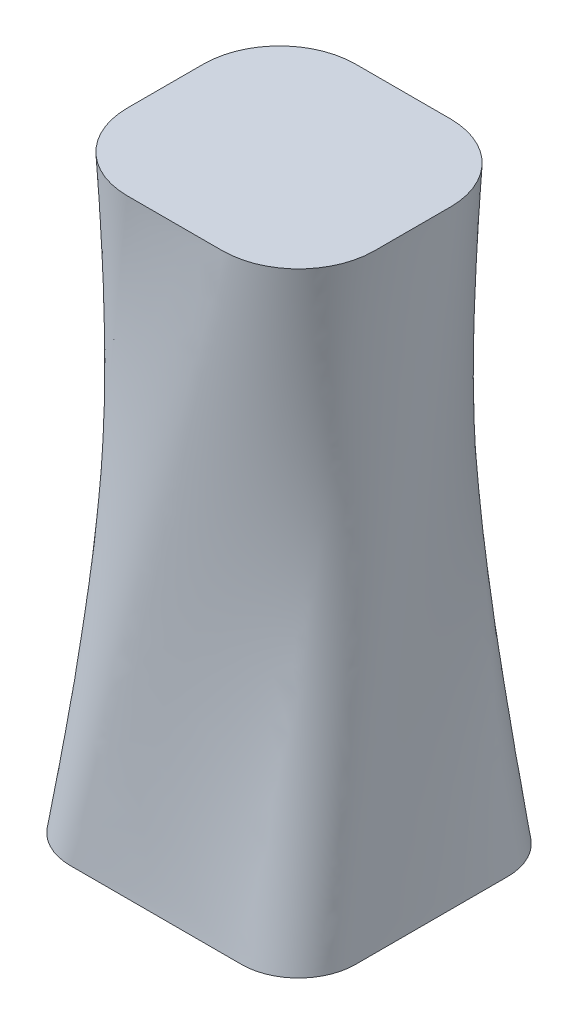
ISO-10303-21;
HEADER;
FILE_DESCRIPTION(('STEP AP214'),'2;1');
FILE_NAME('part.step','',(''),(''),'','','');
FILE_SCHEMA(('AUTOMOTIVE_DESIGN { 1 0 10303 214 1 1 1 1 }'));
ENDSEC;
DATA;
#1=APPLICATION_CONTEXT('core data for automotive mechanical design processes');
#2=APPLICATION_PROTOCOL_DEFINITION('international standard','automotive_design',2000,#1);
#3=PRODUCT_CONTEXT('',#1,'mechanical');
#4=PRODUCT('Part','Part','',(#3));
#5=PRODUCT_RELATED_PRODUCT_CATEGORY('part','',(#4));
#6=PRODUCT_DEFINITION_FORMATION('','',#4);
#7=PRODUCT_DEFINITION_CONTEXT('part definition',#1,'design');
#8=PRODUCT_DEFINITION('design','',#6,#7);
#9=PRODUCT_DEFINITION_SHAPE('','',#8);
#10=(LENGTH_UNIT() NAMED_UNIT(*) SI_UNIT(.MILLI.,.METRE.));
#11=(NAMED_UNIT(*) PLANE_ANGLE_UNIT() SI_UNIT($,.RADIAN.));
#12=(NAMED_UNIT(*) SI_UNIT($,.STERADIAN.) SOLID_ANGLE_UNIT());
#13=UNCERTAINTY_MEASURE_WITH_UNIT(LENGTH_MEASURE(1.E-05),#10,'distance_accuracy_value','');
#14=(GEOMETRIC_REPRESENTATION_CONTEXT(3) GLOBAL_UNCERTAINTY_ASSIGNED_CONTEXT((#13)) GLOBAL_UNIT_ASSIGNED_CONTEXT((#10,
#11,#12)) REPRESENTATION_CONTEXT('',''));
#15=CARTESIAN_POINT('',(0.,0.,0.));
#16=DIRECTION('',(0.,0.,1.));
#17=DIRECTION('',(1.,0.,0.));
#18=AXIS2_PLACEMENT_3D('',#15,#16,#17);
#19=CARTESIAN_POINT('',(-2.5,31.,2.));
#20=DIRECTION('',(0.,1.,0.));
#21=DIRECTION('',(0.,0.,1.));
#22=AXIS2_PLACEMENT_3D('',#19,#20,#21);
#23=PLANE('',#22);
#24=DIRECTION('',(0.,0.,1.));
#25=VECTOR('',#24,1.);
#26=CARTESIAN_POINT('',(-6.5,31.,-1.99999999999997));
#27=LINE('',#26,#25);
#28=CARTESIAN_POINT('',(-6.5,31.,-1.99999999999997));
#29=VERTEX_POINT('',#28);
#30=CARTESIAN_POINT('',(-6.5,31.,1.99999999981758));
#31=VERTEX_POINT('',#30);
#32=EDGE_CURVE('E422',#29,#31,#27,.T.);
#33=ORIENTED_EDGE('',*,*,#32,.T.);
#34=CARTESIAN_POINT('',(-2.5,31.,2.));
#35=DIRECTION('',(0.,1.,0.));
#36=DIRECTION('',(0.,0.,1.));
#37=AXIS2_PLACEMENT_3D('',#34,#35,#36);
#38=CIRCLE('',#37,4.);
#39=CARTESIAN_POINT('',(-2.49999999984952,31.,6.));
#40=VERTEX_POINT('',#39);
#41=EDGE_CURVE('E538',#31,#40,#38,.T.);
#42=ORIENTED_EDGE('',*,*,#41,.T.);
#43=DIRECTION('',(1.,0.,0.));
#44=VECTOR('',#43,1.);
#45=CARTESIAN_POINT('',(-2.49999999999997,31.,6.));
#46=LINE('',#45,#44);
#47=CARTESIAN_POINT('',(2.50000000000677,31.,6.));
#48=VERTEX_POINT('',#47);
#49=EDGE_CURVE('E530',#40,#48,#46,.T.);
#50=ORIENTED_EDGE('',*,*,#49,.T.);
#51=CARTESIAN_POINT('',(2.5,31.,2.));
#52=DIRECTION('',(0.,1.,0.));
#53=DIRECTION('',(0.,0.,1.));
#54=AXIS2_PLACEMENT_3D('',#51,#52,#53);
#55=CIRCLE('',#54,4.);
#56=CARTESIAN_POINT('',(6.5,31.,1.99999999999073));
#57=VERTEX_POINT('',#56);
#58=EDGE_CURVE('E518',#48,#57,#55,.T.);
#59=ORIENTED_EDGE('',*,*,#58,.T.);
#60=DIRECTION('',(0.,0.,1.));
#61=VECTOR('',#60,1.);
#62=CARTESIAN_POINT('',(6.5,31.,-1.99999999999997));
#63=LINE('',#62,#61);
#64=CARTESIAN_POINT('',(6.5,31.,-1.99999999986419));
#65=VERTEX_POINT('',#64);
#66=EDGE_CURVE('E513',#65,#57,#63,.T.);
#67=ORIENTED_EDGE('',*,*,#66,.F.);
#68=CARTESIAN_POINT('',(2.5,31.,-2.));
#69=DIRECTION('',(0.,1.,0.));
#70=DIRECTION('',(0.,0.,1.));
#71=AXIS2_PLACEMENT_3D('',#68,#69,#70);
#72=CIRCLE('',#71,4.);
#73=CARTESIAN_POINT('',(2.49999999984938,31.,-6.));
#74=VERTEX_POINT('',#73);
#75=EDGE_CURVE('E504',#65,#74,#72,.T.);
#76=ORIENTED_EDGE('',*,*,#75,.T.);
#77=DIRECTION('',(1.,0.,0.));
#78=VECTOR('',#77,1.);
#79=CARTESIAN_POINT('',(-2.49999999999997,31.,-6.));
#80=LINE('',#79,#78);
#81=CARTESIAN_POINT('',(-2.49999999999997,31.,-6.));
#82=VERTEX_POINT('',#81);
#83=EDGE_CURVE('E238',#82,#74,#80,.T.);
#84=ORIENTED_EDGE('',*,*,#83,.F.);
#85=CARTESIAN_POINT('',(-2.5,31.,-2.));
#86=DIRECTION('',(0.,1.,0.));
#87=DIRECTION('',(0.,0.,1.));
#88=AXIS2_PLACEMENT_3D('',#85,#86,#87);
#89=CIRCLE('',#88,4.);
#90=EDGE_CURVE('E12',#82,#29,#89,.T.);
#91=ORIENTED_EDGE('',*,*,#90,.T.);
#92=EDGE_LOOP('',(#33,#42,#50,#59,#67,#76,#84,#91));
#93=FACE_BOUND('',#92,.T.);
#94=ADVANCED_FACE('F229',(#93),#23,.T.);
#95=CARTESIAN_POINT('',(-4.5,0.,4.));
#96=DIRECTION('',(0.,1.,0.));
#97=DIRECTION('',(0.,0.,1.));
#98=AXIS2_PLACEMENT_3D('',#95,#96,#97);
#99=PLANE('',#98);
#100=DIRECTION('',(0.,0.,1.));
#101=VECTOR('',#100,1.);
#102=CARTESIAN_POINT('',(-7.5,0.,-3.99999999999998));
#103=LINE('',#102,#101);
#104=CARTESIAN_POINT('',(-7.5,0.,-3.99999999999998));
#105=VERTEX_POINT('',#104);
#106=CARTESIAN_POINT('',(-7.5,0.,3.99999999999998));
#107=VERTEX_POINT('',#106);
#108=EDGE_CURVE('E297',#105,#107,#103,.T.);
#109=ORIENTED_EDGE('',*,*,#108,.F.);
#110=CARTESIAN_POINT('',(-4.5,0.,-4.));
#111=DIRECTION('',(0.,1.,0.));
#112=DIRECTION('',(0.,0.,1.));
#113=AXIS2_PLACEMENT_3D('',#110,#111,#112);
#114=CIRCLE('',#113,3.);
#115=CARTESIAN_POINT('',(-4.49999999999998,0.,-7.));
#116=VERTEX_POINT('',#115);
#117=EDGE_CURVE('E313',#116,#105,#114,.T.);
#118=ORIENTED_EDGE('',*,*,#117,.F.);
#119=DIRECTION('',(1.,0.,0.));
#120=VECTOR('',#119,1.);
#121=CARTESIAN_POINT('',(-4.49999999999998,0.,-7.));
#122=LINE('',#121,#120);
#123=CARTESIAN_POINT('',(4.49999999999998,0.,-7.));
#124=VERTEX_POINT('',#123);
#125=EDGE_CURVE('E424',#116,#124,#122,.T.);
#126=ORIENTED_EDGE('',*,*,#125,.T.);
#127=CARTESIAN_POINT('',(4.5,0.,-4.));
#128=DIRECTION('',(0.,1.,0.));
#129=DIRECTION('',(0.,0.,1.));
#130=AXIS2_PLACEMENT_3D('',#127,#128,#129);
#131=CIRCLE('',#130,3.);
#132=CARTESIAN_POINT('',(7.5,0.,-3.99999999999998));
#133=VERTEX_POINT('',#132);
#134=EDGE_CURVE('E445',#133,#124,#131,.T.);
#135=ORIENTED_EDGE('',*,*,#134,.F.);
#136=DIRECTION('',(0.,0.,1.));
#137=VECTOR('',#136,1.);
#138=CARTESIAN_POINT('',(7.5,0.,-3.99999999999998));
#139=LINE('',#138,#137);
#140=CARTESIAN_POINT('',(7.5,0.,3.99999999999998));
#141=VERTEX_POINT('',#140);
#142=EDGE_CURVE('E442',#133,#141,#139,.T.);
#143=ORIENTED_EDGE('',*,*,#142,.T.);
#144=CARTESIAN_POINT('',(4.5,0.,4.));
#145=DIRECTION('',(0.,1.,0.));
#146=DIRECTION('',(0.,0.,1.));
#147=AXIS2_PLACEMENT_3D('',#144,#145,#146);
#148=CIRCLE('',#147,3.);
#149=CARTESIAN_POINT('',(4.49999999999998,0.,7.));
#150=VERTEX_POINT('',#149);
#151=EDGE_CURVE('E464',#150,#141,#148,.T.);
#152=ORIENTED_EDGE('',*,*,#151,.F.);
#153=DIRECTION('',(1.,0.,0.));
#154=VECTOR('',#153,1.);
#155=CARTESIAN_POINT('',(-4.49999999999998,0.,7.));
#156=LINE('',#155,#154);
#157=CARTESIAN_POINT('',(-4.5,0.,7.));
#158=VERTEX_POINT('',#157);
#159=EDGE_CURVE('E301',#158,#150,#156,.T.);
#160=ORIENTED_EDGE('',*,*,#159,.F.);
#161=CARTESIAN_POINT('',(-4.5,0.,4.));
#162=DIRECTION('',(0.,1.,0.));
#163=DIRECTION('',(0.,0.,1.));
#164=AXIS2_PLACEMENT_3D('',#161,#162,#163);
#165=CIRCLE('',#164,3.);
#166=EDGE_CURVE('E298',#107,#158,#165,.T.);
#167=ORIENTED_EDGE('',*,*,#166,.F.);
#168=EDGE_LOOP('',(#109,#118,#126,#135,#143,#152,#160,#167));
#169=FACE_BOUND('',#168,.T.);
#170=ADVANCED_FACE('F299',(#169),#99,.F.);
#171=CARTESIAN_POINT('',(-7.5,0.,3.99999999833455));
#172=CARTESIAN_POINT('',(-2.49999999852181,31.,6.));
#173=CARTESIAN_POINT('',(-7.5,0.,4.43268062166775));
#174=CARTESIAN_POINT('',(-2.1159639488375,31.,6.));
#175=CARTESIAN_POINT('',(-7.31937777126057,0.,5.21781728944466));
#176=CARTESIAN_POINT('',(-1.29794523551076,31.,6.));
#177=CARTESIAN_POINT('',(-6.68503805717259,0.,6.15551359255273));
#178=CARTESIAN_POINT('',(0.0301714182047144,31.,6.));
#179=CARTESIAN_POINT('',(-5.75040107651129,0.,6.8067756069301));
#180=CARTESIAN_POINT('',(1.33929821834054,31.,6.));
#181=CARTESIAN_POINT('',(-4.94976830088231,0.,7.));
#182=CARTESIAN_POINT('',(2.1299099212814,31.,6.));
#183=CARTESIAN_POINT('',(-3.80706922211005,0.,7.));
#184=CARTESIAN_POINT('',(3.07017535983645,31.,6.));
#185=CARTESIAN_POINT('',(-2.36118976571797,0.,7.));
#186=CARTESIAN_POINT('',(4.14151834668722,31.,5.7595458128356));
#187=CARTESIAN_POINT('',(-0.0614380050539939,0.,7.));
#188=CARTESIAN_POINT('',(5.42310273641352,31.,4.87050244857991));
#189=CARTESIAN_POINT('',(2.27196869013641,0.,7.));
#190=CARTESIAN_POINT('',(6.27992651908755,31.,3.58462258470245));
#191=CARTESIAN_POINT('',(3.7748015249726,0.,7.));
#192=CARTESIAN_POINT('',(6.50000000000001,31.,2.54384033776577));
#193=CARTESIAN_POINT('',(4.91750060395481,0.,7.));
#194=CARTESIAN_POINT('',(6.5,31.,1.6869082323727));
#195=CARTESIAN_POINT('',(5.71763908175937,0.,6.82640753124153));
#196=CARTESIAN_POINT('',(6.50000000000001,31.,1.03916363355548));
#197=CARTESIAN_POINT('',(6.6896190376722,0.,6.15775292897931));
#198=CARTESIAN_POINT('',(6.49999999999999,31.,0.0226839039705459));
#199=CARTESIAN_POINT('',(7.33828490119332,0.,5.18352472394748));
#200=CARTESIAN_POINT('',(6.50000000000001,31.,-1.00572024928125));
#201=CARTESIAN_POINT('',(7.5,0.,4.40234486648921));
#202=CARTESIAN_POINT('',(6.5,31.,-1.67453899870387));
#203=CARTESIAN_POINT('',(7.5,0.,3.34297912074172));
#204=CARTESIAN_POINT('',(6.50000000000001,31.,-2.53147110417742));
#205=CARTESIAN_POINT('',(7.50000000000002,0.,1.99865119187058));
#206=CARTESIAN_POINT('',(6.28793458543806,30.9999999999999,-3.56923663381483));
#207=CARTESIAN_POINT('',(7.49999999999999,0.,-0.0548376465408945));
#208=CARTESIAN_POINT('',(5.42500270127936,31.0000000000001,-4.87221530250068));
#209=CARTESIAN_POINT('',(7.50000000000001,0.,-2.07995211905528));
#210=CARTESIAN_POINT('',(4.12557436206181,31.,-5.76847263144623));
#211=CARTESIAN_POINT('',(7.5,0.,-3.37331487611765));
#212=CARTESIAN_POINT('',(3.05622938748327,31.,-6.));
#213=CARTESIAN_POINT('',(7.5,0.,-4.43268062166775));
#214=CARTESIAN_POINT('',(2.11596394883748,31.,-6.));
#215=CARTESIAN_POINT('',(7.31937777126056,0.,-5.21781728944466));
#216=CARTESIAN_POINT('',(1.29794523551074,31.,-5.99999999999999));
#217=CARTESIAN_POINT('',(6.68503805717258,0.,-6.15551359255273));
#218=CARTESIAN_POINT('',(-0.0301714182047216,31.,-6.));
#219=CARTESIAN_POINT('',(5.75040107651128,0.,-6.80677560693012));
#220=CARTESIAN_POINT('',(-1.33929821834054,31.,-6.));
#221=CARTESIAN_POINT('',(4.94976830088229,0.,-7.));
#222=CARTESIAN_POINT('',(-2.1299099212814,31.,-6.));
#223=CARTESIAN_POINT('',(3.80706922211003,0.,-7.));
#224=CARTESIAN_POINT('',(-3.07017535983645,31.,-6.));
#225=CARTESIAN_POINT('',(2.36118976571795,0.,-6.99999999999999));
#226=CARTESIAN_POINT('',(-4.14151834668721,31.,-5.7595458128356));
#227=CARTESIAN_POINT('',(0.0614380050539796,0.,-7.00000000000001));
#228=CARTESIAN_POINT('',(-5.42310273641353,31.,-4.87050244857991));
#229=CARTESIAN_POINT('',(-2.27196869013642,0.,-6.99999999999999));
#230=CARTESIAN_POINT('',(-6.27992651908754,31.,-3.58462258470245));
#231=CARTESIAN_POINT('',(-3.7748015249726,0.,-7.));
#232=CARTESIAN_POINT('',(-6.5,31.,-2.54384033776577));
#233=CARTESIAN_POINT('',(-4.91750060395481,0.,-7.));
#234=CARTESIAN_POINT('',(-6.5,31.,-1.6869082323727));
#235=CARTESIAN_POINT('',(-5.71763908175937,0.,-6.82640753124155));
#236=CARTESIAN_POINT('',(-6.5,31.,-1.03916363355548));
#237=CARTESIAN_POINT('',(-6.68961903767221,0.,-6.15775292897929));
#238=CARTESIAN_POINT('',(-6.5,31.,-0.0226839039705443));
#239=CARTESIAN_POINT('',(-7.33828490119331,0.,-5.18352472394749));
#240=CARTESIAN_POINT('',(-6.5,31.,1.00572024928125));
#241=CARTESIAN_POINT('',(-7.5,0.,-4.40234486648921));
#242=CARTESIAN_POINT('',(-6.5,31.,1.67453899870386));
#243=CARTESIAN_POINT('',(-7.5,0.,-3.34297912074172));
#244=CARTESIAN_POINT('',(-6.5,31.,2.53147110417742));
#245=CARTESIAN_POINT('',(-7.50000000000001,0.,-1.99865119187058));
#246=CARTESIAN_POINT('',(-6.28793458543806,31.,3.56923663381482));
#247=CARTESIAN_POINT('',(-7.49999999999999,0.,0.0548376465408955));
#248=CARTESIAN_POINT('',(-5.42500270127938,31.,4.87221530250066));
#249=CARTESIAN_POINT('',(-7.50000000000001,0.,2.07995211905527));
#250=CARTESIAN_POINT('',(-4.12557436206183,31.,5.76847263144622));
#251=CARTESIAN_POINT('',(-7.5,0.,3.37331487611765));
#252=CARTESIAN_POINT('',(-3.0562293874833,31.,6.));
#253=CARTESIAN_POINT('',(-7.5,0.,3.99999999833455));
#254=CARTESIAN_POINT('',(-2.49999999852181,31.,6.));
#255=B_SPLINE_SURFACE_WITH_KNOTS('',3,1,((#171,#172),(#173,#174),(#175,#176),(#177,#178),(#179,
#180),(#181,#182),(#183,#184),(#185,#186),(#187,#188),(#189,#190),(#191,#192),(#193,#194),(#195,
#196),(#197,#198),(#199,#200),(#201,#202),(#203,#204),(#205,#206),(#207,#208),(#209,#210),(#211,
#212),(#213,#214),(#215,#216),(#217,#218),(#219,#220),(#221,#222),(#223,#224),(#225,#226),(#227,
#228),(#229,#230),(#231,#232),(#233,#234),(#235,#236),(#237,#238),(#239,#240),(#241,#242),(#243,
#244),(#245,#246),(#247,#248),(#249,#250),(#251,#252),(#253,#254)),.UNSPECIFIED.,.T.,.F.,.F.,(4,
1,1,1,2,1,1,1,2,1,1,1,2,1,1,1,2,1,1,1,2,1,1,1,2,1,1,1,2,1,1,1,4),(2,2),(0.,0.0256359154973813,
0.0512718309947626,0.0769077464921438,0.102543661989525,0.142039363925591,0.181535065861657,
0.221030767797723,0.260526469733789,0.283264354722579,0.306002239711369,0.328740124700159,
0.351478009688949,0.388608507266712,0.425739004844474,0.462869502422237,0.5,0.525635915497382,
0.551271830994763,0.576907746492144,0.602543661989525,0.642039363925591,0.681535065861657,
0.721030767797723,0.760526469733789,0.783264354722579,0.806002239711369,0.828740124700159,
0.851478009688949,0.888608507266712,0.925739004844474,0.962869502422237,1.),(0.,1.),.UNSPECIFIED.);
#256=ORIENTED_EDGE('',*,*,#117,.T.);
#257=ORIENTED_EDGE('',*,*,#108,.T.);
#258=ORIENTED_EDGE('',*,*,#166,.T.);
#259=ORIENTED_EDGE('',*,*,#159,.T.);
#260=ORIENTED_EDGE('',*,*,#151,.T.);
#261=ORIENTED_EDGE('',*,*,#142,.F.);
#262=ORIENTED_EDGE('',*,*,#134,.T.);
#263=ORIENTED_EDGE('',*,*,#125,.F.);
#264=EDGE_LOOP('',(#256,#257,#258,#259,#260,#261,#262,#263));
#265=FACE_BOUND('',#264,.T.);
#266=ORIENTED_EDGE('',*,*,#83,.T.);
#267=ORIENTED_EDGE('',*,*,#75,.F.);
#268=ORIENTED_EDGE('',*,*,#66,.T.);
#269=ORIENTED_EDGE('',*,*,#58,.F.);
#270=ORIENTED_EDGE('',*,*,#49,.F.);
#271=ORIENTED_EDGE('',*,*,#41,.F.);
#272=ORIENTED_EDGE('',*,*,#32,.F.);
#273=ORIENTED_EDGE('',*,*,#90,.F.);
#274=EDGE_LOOP('',(#266,#267,#268,#269,#270,#271,#272,#273));
#275=FACE_BOUND('',#274,.T.);
#276=ADVANCED_FACE('F311',(#265,#275),#255,.T.);
#277=CLOSED_SHELL('',(#94,#170,#276));
#278=MANIFOLD_SOLID_BREP('B2',#277);
#279=ADVANCED_BREP_SHAPE_REPRESENTATION('',(#18,#278),#14);
#280=SHAPE_DEFINITION_REPRESENTATION(#9,#279);
ENDSEC;
END-ISO-10303-21;
